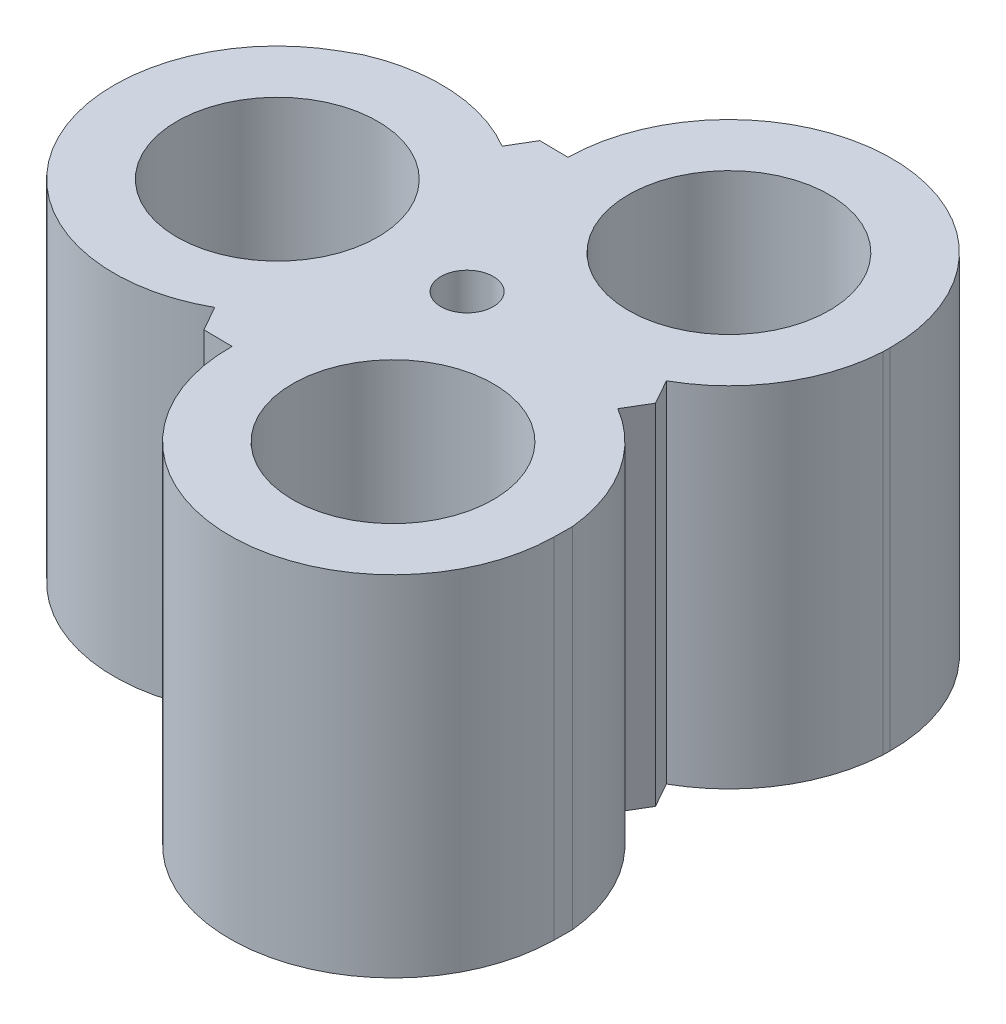
ISO-10303-21;
HEADER;
FILE_DESCRIPTION(('STEP AP214'),'2;1');
FILE_NAME('part.step','',(''),(''),'','','');
FILE_SCHEMA(('AUTOMOTIVE_DESIGN { 1 0 10303 214 1 1 1 1 }'));
ENDSEC;
DATA;
#1=APPLICATION_CONTEXT('core data for automotive mechanical design processes');
#2=APPLICATION_PROTOCOL_DEFINITION('international standard','automotive_design',2000,#1);
#3=PRODUCT_CONTEXT('',#1,'mechanical');
#4=PRODUCT('Part','Part','',(#3));
#5=PRODUCT_RELATED_PRODUCT_CATEGORY('part','',(#4));
#6=PRODUCT_DEFINITION_FORMATION('','',#4);
#7=PRODUCT_DEFINITION_CONTEXT('part definition',#1,'design');
#8=PRODUCT_DEFINITION('design','',#6,#7);
#9=PRODUCT_DEFINITION_SHAPE('','',#8);
#10=(LENGTH_UNIT() NAMED_UNIT(*) SI_UNIT(.MILLI.,.METRE.));
#11=(NAMED_UNIT(*) PLANE_ANGLE_UNIT() SI_UNIT($,.RADIAN.));
#12=(NAMED_UNIT(*) SI_UNIT($,.STERADIAN.) SOLID_ANGLE_UNIT());
#13=UNCERTAINTY_MEASURE_WITH_UNIT(LENGTH_MEASURE(1.E-05),#10,'distance_accuracy_value','');
#14=(GEOMETRIC_REPRESENTATION_CONTEXT(3) GLOBAL_UNCERTAINTY_ASSIGNED_CONTEXT((#13)) GLOBAL_UNIT_ASSIGNED_CONTEXT((#10,
#11,#12)) REPRESENTATION_CONTEXT('',''));
#15=CARTESIAN_POINT('',(0.,0.,0.));
#16=DIRECTION('',(0.,0.,1.));
#17=DIRECTION('',(1.,0.,0.));
#18=AXIS2_PLACEMENT_3D('',#15,#16,#17);
#19=CARTESIAN_POINT('',(0.,20.,0.));
#20=DIRECTION('',(0.,1.,0.));
#21=DIRECTION('',(0.,0.,1.));
#22=AXIS2_PLACEMENT_3D('',#19,#20,#21);
#23=PLANE('',#22);
#24=CARTESIAN_POINT('',(0.,20.,0.));
#25=DIRECTION('',(0.,1.,0.));
#26=DIRECTION('',(0.,0.,1.));
#27=AXIS2_PLACEMENT_3D('',#24,#25,#26);
#28=CIRCLE('',#27,1.5);
#29=CARTESIAN_POINT('',(0.,20.,1.5));
#30=VERTEX_POINT('',#29);
#31=EDGE_CURVE('E441',#30,#30,#28,.T.);
#32=ORIENTED_EDGE('',*,*,#31,.F.);
#33=EDGE_LOOP('',(#32));
#34=FACE_BOUND('',#33,.T.);
#35=CARTESIAN_POINT('',(5.56465245460964,20.,-9.43064913245143));
#36=DIRECTION('',(0.,1.,0.));
#37=DIRECTION('',(0.,0.,1.));
#38=AXIS2_PLACEMENT_3D('',#35,#36,#37);
#39=CIRCLE('',#38,5.75000000000001);
#40=CARTESIAN_POINT('',(5.56465245460964,20.,-3.68064913245143));
#41=VERTEX_POINT('',#40);
#42=EDGE_CURVE('E373',#41,#41,#39,.T.);
#43=ORIENTED_EDGE('',*,*,#42,.F.);
#44=EDGE_LOOP('',(#43));
#45=FACE_BOUND('',#44,.T.);
#46=CARTESIAN_POINT('',(5.32530520249275,20.,9.56784325228541));
#47=DIRECTION('',(0.,1.,0.));
#48=DIRECTION('',(0.,0.,1.));
#49=AXIS2_PLACEMENT_3D('',#46,#47,#48);
#50=CIRCLE('',#49,5.75);
#51=CARTESIAN_POINT('',(5.32530520249275,20.,15.3178432522854));
#52=VERTEX_POINT('',#51);
#53=EDGE_CURVE('E368',#52,#52,#50,.T.);
#54=ORIENTED_EDGE('',*,*,#53,.F.);
#55=EDGE_LOOP('',(#54));
#56=FACE_BOUND('',#55,.T.);
#57=CARTESIAN_POINT('',(-11.0081982102361,20.,-0.13868374074223));
#58=DIRECTION('',(0.,1.,0.));
#59=DIRECTION('',(0.,0.,1.));
#60=AXIS2_PLACEMENT_3D('',#57,#58,#59);
#61=CIRCLE('',#60,5.75);
#62=CARTESIAN_POINT('',(-11.0081982102361,20.,5.61131625925777));
#63=VERTEX_POINT('',#62);
#64=EDGE_CURVE('E372',#63,#63,#61,.T.);
#65=ORIENTED_EDGE('',*,*,#64,.F.);
#66=EDGE_LOOP('',(#65));
#67=FACE_BOUND('',#66,.T.);
#68=DIRECTION('',(-0.510869841738297,0.,0.859658074354151));
#69=VECTOR('',#68,1.);
#70=CARTESIAN_POINT('',(-1.1006195570536,20.,-16.8105036264622));
#71=LINE('',#70,#69);
#72=CARTESIAN_POINT('',(-5.40413223791524,20.,-9.56883633289091));
#73=VERTEX_POINT('',#72);
#74=CARTESIAN_POINT('',(-6.20931797443657,20.,-8.21392288292074));
#75=VERTEX_POINT('',#74);
#76=EDGE_CURVE('E448',#73,#75,#71,.T.);
#77=ORIENTED_EDGE('',*,*,#76,.T.);
#78=CARTESIAN_POINT('',(-11.0081982102361,20.,-0.13868374074223));
#79=DIRECTION('',(0.,1.,0.));
#80=DIRECTION('',(0.,0.,1.));
#81=AXIS2_PLACEMENT_3D('',#78,#79,#80);
#82=CIRCLE('',#81,9.3935477174984);
#83=CARTESIAN_POINT('',(-14.7353188442584,20.,-8.76117238963965));
#84=VERTEX_POINT('',#83);
#85=EDGE_CURVE('E343',#75,#84,#82,.T.);
#86=ORIENTED_EDGE('',*,*,#85,.T.);
#87=DIRECTION('',(-0.872255298149777,0.,0.489050810089958));
#88=VECTOR('',#87,1.);
#89=CARTESIAN_POINT('',(-15.5777729634688,20.,-8.28883032380479));
#90=LINE('',#89,#88);
#91=CARTESIAN_POINT('',(-15.5777729634688,20.,-8.28883032380479));
#92=VERTEX_POINT('',#91);
#93=EDGE_CURVE('E339',#84,#92,#90,.T.);
#94=ORIENTED_EDGE('',*,*,#93,.T.);
#95=CARTESIAN_POINT('',(-11.0081982102361,20.,-0.13868374074223));
#96=DIRECTION('',(0.,1.,0.));
#97=DIRECTION('',(0.,0.,1.));
#98=AXIS2_PLACEMENT_3D('',#95,#96,#97);
#99=CIRCLE('',#98,9.34376277260867);
#100=CARTESIAN_POINT('',(-6.43862345700346,20.,8.01146284232033));
#101=VERTEX_POINT('',#100);
#102=EDGE_CURVE('E342',#92,#101,#99,.T.);
#103=ORIENTED_EDGE('',*,*,#102,.T.);
#104=DIRECTION('',(0.489050810089958,0.,0.872255298149777));
#105=VECTOR('',#104,1.);
#106=CARTESIAN_POINT('',(-6.43862345700346,20.,8.01146284232033));
#107=LINE('',#106,#105);
#108=CARTESIAN_POINT('',(-5.64347949003213,20.,9.42965605184594));
#109=VERTEX_POINT('',#108);
#110=EDGE_CURVE('E187',#101,#109,#107,.T.);
#111=ORIENTED_EDGE('',*,*,#110,.T.);
#112=DIRECTION('',(0.999920651828255,0.,0.0125972237956252));
#113=VECTOR('',#112,1.);
#114=CARTESIAN_POINT('',(-14.0084680002886,20.,9.32427205750712));
#115=LINE('',#114,#113);
#116=CARTESIAN_POINT('',(-4.00926148200608,20.,9.45024429546337));
#117=VERTEX_POINT('',#116);
#118=EDGE_CURVE('E318',#109,#117,#115,.T.);
#119=ORIENTED_EDGE('',*,*,#118,.T.);
#120=CARTESIAN_POINT('',(5.32530520249275,20.,9.56784325228541));
#121=DIRECTION('',(0.,1.,0.));
#122=DIRECTION('',(0.,0.,1.));
#123=AXIS2_PLACEMENT_3D('',#120,#121,#122);
#124=CIRCLE('',#123,9.33530742407561);
#125=CARTESIAN_POINT('',(14.6598718869916,20.,9.68544220910746));
#126=VERTEX_POINT('',#125);
#127=EDGE_CURVE('E313',#117,#126,#124,.T.);
#128=ORIENTED_EDGE('',*,*,#127,.T.);
#129=DIRECTION('',(0.0125972237956255,0.,-0.999920651828255));
#130=VECTOR('',#129,1.);
#131=CARTESIAN_POINT('',(14.8992191391085,20.,-9.31305017562939));
#132=LINE('',#131,#130);
#133=CARTESIAN_POINT('',(14.6730284435592,20.,8.64112380749925));
#134=VERTEX_POINT('',#133);
#135=EDGE_CURVE('E291',#126,#134,#132,.T.);
#136=ORIENTED_EDGE('',*,*,#135,.T.);
#137=CARTESIAN_POINT('',(5.32530520249275,20.,9.56784325228541));
#138=DIRECTION('',(0.,1.,0.));
#139=DIRECTION('',(0.,0.,1.));
#140=AXIS2_PLACEMENT_3D('',#137,#138,#139);
#141=CIRCLE('',#140,9.3935477174984);
#142=CARTESIAN_POINT('',(10.1241854382923,20.,1.4926041101069));
#143=VERTEX_POINT('',#142);
#144=EDGE_CURVE('E301',#134,#143,#141,.T.);
#145=ORIENTED_EDGE('',*,*,#144,.T.);
#146=DIRECTION('',(0.510869841738297,0.,-0.859658074354152));
#147=VECTOR('',#146,1.);
#148=CARTESIAN_POINT('',(10.1241854382923,20.,1.4926041101069));
#149=LINE('',#148,#147);
#150=CARTESIAN_POINT('',(10.9293711748136,20.,0.137690660136722));
#151=VERTEX_POINT('',#150);
#152=EDGE_CURVE('E309',#143,#151,#149,.T.);
#153=ORIENTED_EDGE('',*,*,#152,.T.);
#154=DIRECTION('',(-0.489050810089957,0.,-0.872255298149777));
#155=VECTOR('',#154,1.);
#156=CARTESIAN_POINT('',(15.0247353087419,20.,7.4420504321089));
#157=LINE('',#156,#155);
#158=CARTESIAN_POINT('',(10.1342272078423,20.,-1.28050254938887));
#159=VERTEX_POINT('',#158);
#160=EDGE_CURVE('E331',#151,#159,#157,.T.);
#161=ORIENTED_EDGE('',*,*,#160,.T.);
#162=CARTESIAN_POINT('',(5.56465245460964,20.,-9.43064913245143));
#163=DIRECTION('',(0.,1.,0.));
#164=DIRECTION('',(0.,0.,1.));
#165=AXIS2_PLACEMENT_3D('',#162,#163,#164);
#166=CIRCLE('',#165,9.34376277260867);
#167=CARTESIAN_POINT('',(14.8942128234531,20.,-8.91566750666909));
#168=VERTEX_POINT('',#167);
#169=EDGE_CURVE('E324',#159,#168,#166,.T.);
#170=ORIENTED_EDGE('',*,*,#169,.T.);
#171=CARTESIAN_POINT('',(14.8992191391085,20.,-9.31305017562939));
#172=VERTEX_POINT('',#171);
#173=EDGE_CURVE('E316',#168,#172,#132,.T.);
#174=ORIENTED_EDGE('',*,*,#173,.T.);
#175=CARTESIAN_POINT('',(5.56465245460964,20.,-9.43064913245143));
#176=DIRECTION('',(0.,1.,0.));
#177=DIRECTION('',(0.,0.,1.));
#178=AXIS2_PLACEMENT_3D('',#175,#176,#177);
#179=CIRCLE('',#178,9.33530742407561);
#180=CARTESIAN_POINT('',(-3.7699142298892,20.,-9.54824808927347));
#181=VERTEX_POINT('',#180);
#182=EDGE_CURVE('E323',#172,#181,#179,.T.);
#183=ORIENTED_EDGE('',*,*,#182,.T.);
#184=DIRECTION('',(-0.999920651828255,0.,-0.0125972237956252));
#185=VECTOR('',#184,1.);
#186=CARTESIAN_POINT('',(-3.7699142298892,20.,-9.54824808927347));
#187=LINE('',#186,#185);
#188=EDGE_CURVE('E330',#181,#73,#187,.T.);
#189=ORIENTED_EDGE('',*,*,#188,.T.);
#190=EDGE_LOOP('',(#77,#86,#94,#103,#111,#119,#128,#136,#145,#153,#161,#170,#174,#183,#189));
#191=FACE_BOUND('',#190,.T.);
#192=ADVANCED_FACE('F183',(#34,#45,#56,#67,#191),#23,.T.);
#193=CARTESIAN_POINT('',(0.,0.,0.));
#194=DIRECTION('',(0.,1.,0.));
#195=DIRECTION('',(0.,0.,1.));
#196=AXIS2_PLACEMENT_3D('',#193,#194,#195);
#197=PLANE('',#196);
#198=CARTESIAN_POINT('',(0.,0.,0.));
#199=DIRECTION('',(0.,1.,0.));
#200=DIRECTION('',(0.,0.,1.));
#201=AXIS2_PLACEMENT_3D('',#198,#199,#200);
#202=CIRCLE('',#201,1.5);
#203=CARTESIAN_POINT('',(0.,0.,1.5));
#204=VERTEX_POINT('',#203);
#205=EDGE_CURVE('E445',#204,#204,#202,.T.);
#206=ORIENTED_EDGE('',*,*,#205,.T.);
#207=EDGE_LOOP('',(#206));
#208=FACE_BOUND('',#207,.T.);
#209=CARTESIAN_POINT('',(5.56465245460964,0.,-9.43064913245143));
#210=DIRECTION('',(0.,1.,0.));
#211=DIRECTION('',(0.,0.,1.));
#212=AXIS2_PLACEMENT_3D('',#209,#210,#211);
#213=CIRCLE('',#212,5.75000000000001);
#214=CARTESIAN_POINT('',(5.56465245460964,0.,-3.68064913245143));
#215=VERTEX_POINT('',#214);
#216=EDGE_CURVE('E382',#215,#215,#213,.T.);
#217=ORIENTED_EDGE('',*,*,#216,.T.);
#218=EDGE_LOOP('',(#217));
#219=FACE_BOUND('',#218,.T.);
#220=CARTESIAN_POINT('',(5.32530520249275,0.,9.56784325228541));
#221=DIRECTION('',(0.,1.,0.));
#222=DIRECTION('',(0.,0.,1.));
#223=AXIS2_PLACEMENT_3D('',#220,#221,#222);
#224=CIRCLE('',#223,5.75);
#225=CARTESIAN_POINT('',(5.32530520249275,0.,15.3178432522854));
#226=VERTEX_POINT('',#225);
#227=EDGE_CURVE('E386',#226,#226,#224,.T.);
#228=ORIENTED_EDGE('',*,*,#227,.T.);
#229=EDGE_LOOP('',(#228));
#230=FACE_BOUND('',#229,.T.);
#231=CARTESIAN_POINT('',(-11.0081982102361,0.,-0.13868374074223));
#232=DIRECTION('',(0.,1.,0.));
#233=DIRECTION('',(0.,0.,1.));
#234=AXIS2_PLACEMENT_3D('',#231,#232,#233);
#235=CIRCLE('',#234,5.75);
#236=CARTESIAN_POINT('',(-11.0081982102361,0.,5.61131625925777));
#237=VERTEX_POINT('',#236);
#238=EDGE_CURVE('E381',#237,#237,#235,.T.);
#239=ORIENTED_EDGE('',*,*,#238,.T.);
#240=EDGE_LOOP('',(#239));
#241=FACE_BOUND('',#240,.T.);
#242=CARTESIAN_POINT('',(-11.0081982102361,0.,-0.13868374074223));
#243=DIRECTION('',(0.,1.,0.));
#244=DIRECTION('',(0.,0.,1.));
#245=AXIS2_PLACEMENT_3D('',#242,#243,#244);
#246=CIRCLE('',#245,9.3935477174984);
#247=CARTESIAN_POINT('',(-6.20931797443657,0.,-8.21392288292074));
#248=VERTEX_POINT('',#247);
#249=CARTESIAN_POINT('',(-14.7353188442583,0.,-8.76117238963968));
#250=VERTEX_POINT('',#249);
#251=EDGE_CURVE('E437',#248,#250,#246,.T.);
#252=ORIENTED_EDGE('',*,*,#251,.F.);
#253=DIRECTION('',(-0.510869841738297,0.,0.859658074354151));
#254=VECTOR('',#253,1.);
#255=CARTESIAN_POINT('',(-8.19609683638978,0.,-4.87070245553611));
#256=LINE('',#255,#254);
#257=CARTESIAN_POINT('',(-5.40413223791524,0.,-9.56883633289091));
#258=VERTEX_POINT('',#257);
#259=EDGE_CURVE('E428',#258,#248,#256,.T.);
#260=ORIENTED_EDGE('',*,*,#259,.F.);
#261=DIRECTION('',(-0.999920651828255,0.,-0.0125972237956252));
#262=VECTOR('',#261,1.);
#263=CARTESIAN_POINT('',(0.11967362605844,0.,-9.49924619236842));
#264=LINE('',#263,#262);
#265=CARTESIAN_POINT('',(-3.7699142298892,0.,-9.54824808927347));
#266=VERTEX_POINT('',#265);
#267=EDGE_CURVE('E366',#266,#258,#264,.T.);
#268=ORIENTED_EDGE('',*,*,#267,.F.);
#269=CARTESIAN_POINT('',(5.56465245460964,0.,-9.43064913245143));
#270=DIRECTION('',(0.,1.,0.));
#271=DIRECTION('',(0.,0.,1.));
#272=AXIS2_PLACEMENT_3D('',#269,#270,#271);
#273=CIRCLE('',#272,9.33530742407561);
#274=CARTESIAN_POINT('',(14.8992191391085,0.,-9.31305017562939));
#275=VERTEX_POINT('',#274);
#276=EDGE_CURVE('E367',#275,#266,#273,.T.);
#277=ORIENTED_EDGE('',*,*,#276,.F.);
#278=DIRECTION('',(0.0125972237956255,0.,-0.999920651828255));
#279=VECTOR('',#278,1.);
#280=CARTESIAN_POINT('',(14.77954551305,0.,0.186196016739038));
#281=LINE('',#280,#279);
#282=CARTESIAN_POINT('',(14.8942128234531,0.,-8.91566750666905));
#283=VERTEX_POINT('',#282);
#284=EDGE_CURVE('E362',#283,#275,#281,.T.);
#285=ORIENTED_EDGE('',*,*,#284,.F.);
#286=CARTESIAN_POINT('',(5.56465245460964,0.,-9.43064913245143));
#287=DIRECTION('',(0.,1.,0.));
#288=DIRECTION('',(0.,0.,1.));
#289=AXIS2_PLACEMENT_3D('',#286,#287,#288);
#290=CIRCLE('',#289,9.34376277260867);
#291=CARTESIAN_POINT('',(10.1342272078423,0.,-1.28050254938887));
#292=VERTEX_POINT('',#291);
#293=EDGE_CURVE('E403',#292,#283,#290,.T.);
#294=ORIENTED_EDGE('',*,*,#293,.F.);
#295=DIRECTION('',(-0.489050810089957,0.,-0.872255298149777));
#296=VECTOR('',#295,1.);
#297=CARTESIAN_POINT('',(8.25665018588136,0.,-4.62928854728643));
#298=LINE('',#297,#296);
#299=CARTESIAN_POINT('',(10.9293711748136,0.,0.137690660136721));
#300=VERTEX_POINT('',#299);
#301=EDGE_CURVE('E393',#300,#292,#298,.T.);
#302=ORIENTED_EDGE('',*,*,#301,.F.);
#303=DIRECTION('',(0.510869841738296,0.,-0.859658074354152));
#304=VECTOR('',#303,1.);
#305=CARTESIAN_POINT('',(8.13740657633909,0.,4.83582453749153));
#306=LINE('',#305,#304);
#307=CARTESIAN_POINT('',(10.1241854382923,0.,1.4926041101069));
#308=VERTEX_POINT('',#307);
#309=EDGE_CURVE('E398',#308,#300,#306,.T.);
#310=ORIENTED_EDGE('',*,*,#309,.F.);
#311=CARTESIAN_POINT('',(5.32530520249275,0.,9.56784325228541));
#312=DIRECTION('',(0.,1.,0.));
#313=DIRECTION('',(0.,0.,1.));
#314=AXIS2_PLACEMENT_3D('',#311,#312,#313);
#315=CIRCLE('',#314,9.3935477174984);
#316=CARTESIAN_POINT('',(14.6730284435592,0.,8.64112380749923));
#317=VERTEX_POINT('',#316);
#318=EDGE_CURVE('E406',#317,#308,#315,.T.);
#319=ORIENTED_EDGE('',*,*,#318,.F.);
#320=DIRECTION('',(0.0125972237956255,0.,-0.999920651828255));
#321=VECTOR('',#320,1.);
#322=CARTESIAN_POINT('',(14.77954551305,0.,0.186196016739038));
#323=LINE('',#322,#321);
#324=CARTESIAN_POINT('',(14.6598718869916,0.,9.68544220910746));
#325=VERTEX_POINT('',#324);
#326=EDGE_CURVE('E294',#325,#317,#323,.T.);
#327=ORIENTED_EDGE('',*,*,#326,.F.);
#328=CARTESIAN_POINT('',(5.32530520249275,0.,9.56784325228541));
#329=DIRECTION('',(0.,1.,0.));
#330=DIRECTION('',(0.,0.,1.));
#331=AXIS2_PLACEMENT_3D('',#328,#329,#330);
#332=CIRCLE('',#331,9.33530742407561);
#333=CARTESIAN_POINT('',(-4.00926148200608,0.,9.45024429546337));
#334=VERTEX_POINT('',#333);
#335=EDGE_CURVE('E357',#334,#325,#332,.T.);
#336=ORIENTED_EDGE('',*,*,#335,.F.);
#337=DIRECTION('',(0.999920651828255,0.,0.0125972237956252));
#338=VECTOR('',#337,1.);
#339=CARTESIAN_POINT('',(-0.119673626058439,0.,9.49924619236842));
#340=LINE('',#339,#338);
#341=CARTESIAN_POINT('',(-5.64347949003213,0.,9.42965605184594));
#342=VERTEX_POINT('',#341);
#343=EDGE_CURVE('E298',#342,#334,#340,.T.);
#344=ORIENTED_EDGE('',*,*,#343,.F.);
#345=DIRECTION('',(0.489050810089958,0.,0.872255298149777));
#346=VECTOR('',#345,1.);
#347=CARTESIAN_POINT('',(-8.31620047896441,0.,4.66267684442276));
#348=LINE('',#347,#346);
#349=CARTESIAN_POINT('',(-6.43862345700346,0.,8.01146284232033));
#350=VERTEX_POINT('',#349);
#351=EDGE_CURVE('E377',#350,#342,#348,.T.);
#352=ORIENTED_EDGE('',*,*,#351,.F.);
#353=CARTESIAN_POINT('',(-11.0081982102361,0.,-0.13868374074223));
#354=DIRECTION('',(0.,1.,0.));
#355=DIRECTION('',(0.,0.,1.));
#356=AXIS2_PLACEMENT_3D('',#353,#354,#355);
#357=CIRCLE('',#356,9.34376277260867);
#358=CARTESIAN_POINT('',(-15.5777729634688,0.,-8.28883032380479));
#359=VERTEX_POINT('',#358);
#360=EDGE_CURVE('E427',#359,#350,#357,.T.);
#361=ORIENTED_EDGE('',*,*,#360,.F.);
#362=DIRECTION('',(-0.872255298149777,0.,0.489050810089958));
#363=VECTOR('',#362,1.);
#364=CARTESIAN_POINT('',(-7.26157248450438,0.,-12.9515071682276));
#365=LINE('',#364,#363);
#366=EDGE_CURVE('E254',#250,#359,#365,.T.);
#367=ORIENTED_EDGE('',*,*,#366,.F.);
#368=EDGE_LOOP('',(#252,#260,#268,#277,#285,#294,#302,#310,#319,#327,#336,#344,#352,#361,#367));
#369=FACE_BOUND('',#368,.T.);
#370=ADVANCED_FACE('F185',(#208,#219,#230,#241,#369),#197,.F.);
#371=CARTESIAN_POINT('',(5.56465245460964,-30.,-9.43064913245143));
#372=DIRECTION('',(0.,1.,0.));
#373=DIRECTION('',(0.,0.,1.));
#374=AXIS2_PLACEMENT_3D('',#371,#372,#373);
#375=CYLINDRICAL_SURFACE('',#374,5.75000000000001);
#376=ORIENTED_EDGE('',*,*,#42,.T.);
#377=EDGE_LOOP('',(#376));
#378=FACE_BOUND('',#377,.T.);
#379=ORIENTED_EDGE('',*,*,#216,.F.);
#380=EDGE_LOOP('',(#379));
#381=FACE_BOUND('',#380,.T.);
#382=ADVANCED_FACE('F536',(#378,#381),#375,.F.);
#383=CARTESIAN_POINT('',(5.32530520249275,-30.,9.56784325228541));
#384=DIRECTION('',(0.,1.,0.));
#385=DIRECTION('',(0.,0.,1.));
#386=AXIS2_PLACEMENT_3D('',#383,#384,#385);
#387=CYLINDRICAL_SURFACE('',#386,5.75);
#388=ORIENTED_EDGE('',*,*,#53,.T.);
#389=EDGE_LOOP('',(#388));
#390=FACE_BOUND('',#389,.T.);
#391=ORIENTED_EDGE('',*,*,#227,.F.);
#392=EDGE_LOOP('',(#391));
#393=FACE_BOUND('',#392,.T.);
#394=ADVANCED_FACE('F549',(#390,#393),#387,.F.);
#395=CARTESIAN_POINT('',(-11.0081982102361,-30.,-0.13868374074223));
#396=DIRECTION('',(0.,1.,0.));
#397=DIRECTION('',(0.,0.,1.));
#398=AXIS2_PLACEMENT_3D('',#395,#396,#397);
#399=CYLINDRICAL_SURFACE('',#398,5.75);
#400=ORIENTED_EDGE('',*,*,#64,.T.);
#401=EDGE_LOOP('',(#400));
#402=FACE_BOUND('',#401,.T.);
#403=ORIENTED_EDGE('',*,*,#238,.F.);
#404=EDGE_LOOP('',(#403));
#405=FACE_BOUND('',#404,.T.);
#406=ADVANCED_FACE('F571',(#402,#405),#399,.F.);
#407=CARTESIAN_POINT('',(-6.43862345700346,-30.,8.01146284232033));
#408=DIRECTION('',(-0.872255298149777,0.,0.489050810089957));
#409=DIRECTION('',(0.489050810089958,0.,0.872255298149777));
#410=AXIS2_PLACEMENT_3D('',#407,#408,#409);
#411=PLANE('',#410);
#412=ORIENTED_EDGE('',*,*,#351,.T.);
#413=DIRECTION('',(0.,-1.,0.));
#414=VECTOR('',#413,1.);
#415=CARTESIAN_POINT('',(-5.64347949003213,-30.,9.42965605184594));
#416=LINE('',#415,#414);
#417=EDGE_CURVE('E12',#109,#342,#416,.T.);
#418=ORIENTED_EDGE('',*,*,#417,.F.);
#419=ORIENTED_EDGE('',*,*,#110,.F.);
#420=DIRECTION('',(0.,1.,0.));
#421=VECTOR('',#420,1.);
#422=CARTESIAN_POINT('',(-6.43862345700346,-30.,8.01146284232033));
#423=LINE('',#422,#421);
#424=EDGE_CURVE('E434',#350,#101,#423,.T.);
#425=ORIENTED_EDGE('',*,*,#424,.F.);
#426=EDGE_LOOP('',(#412,#418,#419,#425));
#427=FACE_BOUND('',#426,.T.);
#428=ADVANCED_FACE('F567',(#427),#411,.T.);
#429=CARTESIAN_POINT('',(-11.0081982102361,-30.,-0.13868374074223));
#430=DIRECTION('',(0.,1.,0.));
#431=DIRECTION('',(0.,0.,1.));
#432=AXIS2_PLACEMENT_3D('',#429,#430,#431);
#433=CYLINDRICAL_SURFACE('',#432,9.34376277260867);
#434=ORIENTED_EDGE('',*,*,#360,.T.);
#435=ORIENTED_EDGE('',*,*,#424,.T.);
#436=ORIENTED_EDGE('',*,*,#102,.F.);
#437=DIRECTION('',(0.,1.,0.));
#438=VECTOR('',#437,1.);
#439=CARTESIAN_POINT('',(-15.5777729634688,-30.,-8.28883032380479));
#440=LINE('',#439,#438);
#441=EDGE_CURVE('E247',#359,#92,#440,.T.);
#442=ORIENTED_EDGE('',*,*,#441,.F.);
#443=EDGE_LOOP('',(#434,#435,#436,#442));
#444=FACE_BOUND('',#443,.T.);
#445=ADVANCED_FACE('F570',(#444),#433,.T.);
#446=CARTESIAN_POINT('',(-15.5777729634688,-30.,-8.28883032380479));
#447=DIRECTION('',(-0.489050810089958,0.,-0.872255298149777));
#448=DIRECTION('',(-0.872255298149777,0.,0.489050810089958));
#449=AXIS2_PLACEMENT_3D('',#446,#447,#448);
#450=PLANE('',#449);
#451=ORIENTED_EDGE('',*,*,#366,.T.);
#452=ORIENTED_EDGE('',*,*,#441,.T.);
#453=ORIENTED_EDGE('',*,*,#93,.F.);
#454=DIRECTION('',(0.,1.,0.));
#455=VECTOR('',#454,1.);
#456=CARTESIAN_POINT('',(-14.7353188442583,-30.,-8.76117238963968));
#457=LINE('',#456,#455);
#458=EDGE_CURVE('E417',#250,#84,#457,.T.);
#459=ORIENTED_EDGE('',*,*,#458,.F.);
#460=EDGE_LOOP('',(#451,#452,#453,#459));
#461=FACE_BOUND('',#460,.T.);
#462=ADVANCED_FACE('F566',(#461),#450,.T.);
#463=CARTESIAN_POINT('',(-1.1006195570536,-30.,-16.8105036264622));
#464=DIRECTION('',(-0.859658074354151,0.,-0.510869841738297));
#465=DIRECTION('',(-0.510869841738297,0.,0.859658074354151));
#466=AXIS2_PLACEMENT_3D('',#463,#464,#465);
#467=PLANE('',#466);
#468=ORIENTED_EDGE('',*,*,#259,.T.);
#469=DIRECTION('',(0.,1.,0.));
#470=VECTOR('',#469,1.);
#471=CARTESIAN_POINT('',(-6.20931797443657,-30.,-8.21392288292074));
#472=LINE('',#471,#470);
#473=EDGE_CURVE('E431',#248,#75,#472,.T.);
#474=ORIENTED_EDGE('',*,*,#473,.T.);
#475=ORIENTED_EDGE('',*,*,#76,.F.);
#476=DIRECTION('',(0.,1.,0.));
#477=VECTOR('',#476,1.);
#478=CARTESIAN_POINT('',(-5.40413223791524,-30.,-9.56883633289091));
#479=LINE('',#478,#477);
#480=EDGE_CURVE('E397',#258,#73,#479,.T.);
#481=ORIENTED_EDGE('',*,*,#480,.F.);
#482=EDGE_LOOP('',(#468,#474,#475,#481));
#483=FACE_BOUND('',#482,.T.);
#484=ADVANCED_FACE('F505',(#483),#467,.T.);
#485=CARTESIAN_POINT('',(-11.0081982102361,-30.,-0.13868374074223));
#486=DIRECTION('',(0.,1.,0.));
#487=DIRECTION('',(0.,0.,1.));
#488=AXIS2_PLACEMENT_3D('',#485,#486,#487);
#489=CYLINDRICAL_SURFACE('',#488,9.3935477174984);
#490=ORIENTED_EDGE('',*,*,#251,.T.);
#491=ORIENTED_EDGE('',*,*,#458,.T.);
#492=ORIENTED_EDGE('',*,*,#85,.F.);
#493=ORIENTED_EDGE('',*,*,#473,.F.);
#494=EDGE_LOOP('',(#490,#491,#492,#493));
#495=FACE_BOUND('',#494,.T.);
#496=ADVANCED_FACE('F508',(#495),#489,.T.);
#497=CARTESIAN_POINT('',(5.56465245460964,-30.,-9.43064913245143));
#498=DIRECTION('',(0.,1.,0.));
#499=DIRECTION('',(0.,0.,1.));
#500=AXIS2_PLACEMENT_3D('',#497,#498,#499);
#501=CYLINDRICAL_SURFACE('',#500,9.33530742407561);
#502=ORIENTED_EDGE('',*,*,#276,.T.);
#503=DIRECTION('',(0.,1.,0.));
#504=VECTOR('',#503,1.);
#505=CARTESIAN_POINT('',(-3.7699142298892,-30.,-9.54824808927347));
#506=LINE('',#505,#504);
#507=EDGE_CURVE('E363',#266,#181,#506,.T.);
#508=ORIENTED_EDGE('',*,*,#507,.T.);
#509=ORIENTED_EDGE('',*,*,#182,.F.);
#510=DIRECTION('',(0.,1.,0.));
#511=VECTOR('',#510,1.);
#512=CARTESIAN_POINT('',(14.8992191391085,-30.,-9.31305017562939));
#513=LINE('',#512,#511);
#514=EDGE_CURVE('E358',#275,#172,#513,.T.);
#515=ORIENTED_EDGE('',*,*,#514,.F.);
#516=EDGE_LOOP('',(#502,#508,#509,#515));
#517=FACE_BOUND('',#516,.T.);
#518=ADVANCED_FACE('F491',(#517),#501,.T.);
#519=CARTESIAN_POINT('',(-3.7699142298892,-30.,-9.54824808927347));
#520=DIRECTION('',(0.0125972237956252,0.,-0.999920651828255));
#521=DIRECTION('',(-0.999920651828255,0.,-0.0125972237956252));
#522=AXIS2_PLACEMENT_3D('',#519,#520,#521);
#523=PLANE('',#522);
#524=ORIENTED_EDGE('',*,*,#267,.T.);
#525=ORIENTED_EDGE('',*,*,#480,.T.);
#526=ORIENTED_EDGE('',*,*,#188,.F.);
#527=ORIENTED_EDGE('',*,*,#507,.F.);
#528=EDGE_LOOP('',(#524,#525,#526,#527));
#529=FACE_BOUND('',#528,.T.);
#530=ADVANCED_FACE('F498',(#529),#523,.T.);
#531=CARTESIAN_POINT('',(15.0247353087419,-30.,7.4420504321089));
#532=DIRECTION('',(0.872255298149777,0.,-0.489050810089957));
#533=DIRECTION('',(-0.489050810089957,0.,-0.872255298149777));
#534=AXIS2_PLACEMENT_3D('',#531,#532,#533);
#535=PLANE('',#534);
#536=ORIENTED_EDGE('',*,*,#301,.T.);
#537=DIRECTION('',(0.,1.,0.));
#538=VECTOR('',#537,1.);
#539=CARTESIAN_POINT('',(10.1342272078423,-30.,-1.28050254938887));
#540=LINE('',#539,#538);
#541=EDGE_CURVE('E396',#292,#159,#540,.T.);
#542=ORIENTED_EDGE('',*,*,#541,.T.);
#543=ORIENTED_EDGE('',*,*,#160,.F.);
#544=DIRECTION('',(0.,1.,0.));
#545=VECTOR('',#544,1.);
#546=CARTESIAN_POINT('',(10.9293711748136,-30.,0.137690660136723));
#547=LINE('',#546,#545);
#548=EDGE_CURVE('E402',#300,#151,#547,.T.);
#549=ORIENTED_EDGE('',*,*,#548,.F.);
#550=EDGE_LOOP('',(#536,#542,#543,#549));
#551=FACE_BOUND('',#550,.T.);
#552=ADVANCED_FACE('F475',(#551),#535,.T.);
#553=CARTESIAN_POINT('',(10.1241854382923,-30.,1.4926041101069));
#554=DIRECTION('',(0.859658074354152,0.,0.510869841738296));
#555=DIRECTION('',(0.510869841738296,0.,-0.859658074354152));
#556=AXIS2_PLACEMENT_3D('',#553,#554,#555);
#557=PLANE('',#556);
#558=ORIENTED_EDGE('',*,*,#309,.T.);
#559=ORIENTED_EDGE('',*,*,#548,.T.);
#560=ORIENTED_EDGE('',*,*,#152,.F.);
#561=DIRECTION('',(0.,1.,0.));
#562=VECTOR('',#561,1.);
#563=CARTESIAN_POINT('',(10.1241854382923,-30.,1.4926041101069));
#564=LINE('',#563,#562);
#565=EDGE_CURVE('E304',#308,#143,#564,.T.);
#566=ORIENTED_EDGE('',*,*,#565,.F.);
#567=EDGE_LOOP('',(#558,#559,#560,#566));
#568=FACE_BOUND('',#567,.T.);
#569=ADVANCED_FACE('F482',(#568),#557,.T.);
#570=CARTESIAN_POINT('',(5.56465245460964,-30.,-9.43064913245143));
#571=DIRECTION('',(0.,1.,0.));
#572=DIRECTION('',(0.,0.,1.));
#573=AXIS2_PLACEMENT_3D('',#570,#571,#572);
#574=CYLINDRICAL_SURFACE('',#573,9.34376277260867);
#575=ORIENTED_EDGE('',*,*,#293,.T.);
#576=DIRECTION('',(0.,1.,0.));
#577=VECTOR('',#576,1.);
#578=CARTESIAN_POINT('',(14.8942128234531,-30.,-8.91566750666905));
#579=LINE('',#578,#577);
#580=EDGE_CURVE('E361',#168,#283,#579,.F.);
#581=ORIENTED_EDGE('',*,*,#580,.F.);
#582=ORIENTED_EDGE('',*,*,#169,.F.);
#583=ORIENTED_EDGE('',*,*,#541,.F.);
#584=EDGE_LOOP('',(#575,#581,#582,#583));
#585=FACE_BOUND('',#584,.T.);
#586=ADVANCED_FACE('F520',(#585),#574,.T.);
#587=CARTESIAN_POINT('',(5.32530520249275,-30.,9.56784325228541));
#588=DIRECTION('',(0.,1.,0.));
#589=DIRECTION('',(0.,0.,1.));
#590=AXIS2_PLACEMENT_3D('',#587,#588,#589);
#591=CYLINDRICAL_SURFACE('',#590,9.3935477174984);
#592=ORIENTED_EDGE('',*,*,#318,.T.);
#593=ORIENTED_EDGE('',*,*,#565,.T.);
#594=ORIENTED_EDGE('',*,*,#144,.F.);
#595=DIRECTION('',(0.,1.,0.));
#596=VECTOR('',#595,1.);
#597=CARTESIAN_POINT('',(14.6730284435592,-30.,8.64112380749923));
#598=LINE('',#597,#596);
#599=EDGE_CURVE('E286',#317,#134,#598,.T.);
#600=ORIENTED_EDGE('',*,*,#599,.F.);
#601=EDGE_LOOP('',(#592,#593,#594,#600));
#602=FACE_BOUND('',#601,.T.);
#603=ADVANCED_FACE('F302',(#602),#591,.T.);
#604=CARTESIAN_POINT('',(14.8992191391085,-30.,-9.31305017562939));
#605=DIRECTION('',(0.999920651828255,0.,0.0125972237956255));
#606=DIRECTION('',(0.0125972237956255,0.,-0.999920651828255));
#607=AXIS2_PLACEMENT_3D('',#604,#605,#606);
#608=PLANE('',#607);
#609=ORIENTED_EDGE('',*,*,#284,.T.);
#610=ORIENTED_EDGE('',*,*,#514,.T.);
#611=ORIENTED_EDGE('',*,*,#173,.F.);
#612=ORIENTED_EDGE('',*,*,#580,.T.);
#613=EDGE_LOOP('',(#609,#610,#611,#612));
#614=FACE_BOUND('',#613,.T.);
#615=ADVANCED_FACE('F519',(#614),#608,.T.);
#616=CARTESIAN_POINT('',(5.32530520249275,-30.,9.56784325228541));
#617=DIRECTION('',(0.,1.,0.));
#618=DIRECTION('',(0.,0.,1.));
#619=AXIS2_PLACEMENT_3D('',#616,#617,#618);
#620=CYLINDRICAL_SURFACE('',#619,9.33530742407561);
#621=ORIENTED_EDGE('',*,*,#335,.T.);
#622=DIRECTION('',(0.,1.,0.));
#623=VECTOR('',#622,1.);
#624=CARTESIAN_POINT('',(14.6598718869916,-30.,9.68544220910746));
#625=LINE('',#624,#623);
#626=EDGE_CURVE('E354',#325,#126,#625,.T.);
#627=ORIENTED_EDGE('',*,*,#626,.T.);
#628=ORIENTED_EDGE('',*,*,#127,.F.);
#629=DIRECTION('',(0.,1.,0.));
#630=VECTOR('',#629,1.);
#631=CARTESIAN_POINT('',(-4.00926148200608,-30.,9.45024429546337));
#632=LINE('',#631,#630);
#633=EDGE_CURVE('E194',#334,#117,#632,.T.);
#634=ORIENTED_EDGE('',*,*,#633,.F.);
#635=EDGE_LOOP('',(#621,#627,#628,#634));
#636=FACE_BOUND('',#635,.T.);
#637=ADVANCED_FACE('F555',(#636),#620,.T.);
#638=ORIENTED_EDGE('',*,*,#326,.T.);
#639=ORIENTED_EDGE('',*,*,#599,.T.);
#640=ORIENTED_EDGE('',*,*,#135,.F.);
#641=ORIENTED_EDGE('',*,*,#626,.F.);
#642=EDGE_LOOP('',(#638,#639,#640,#641));
#643=FACE_BOUND('',#642,.T.);
#644=ADVANCED_FACE('F288',(#643),#608,.T.);
#645=CARTESIAN_POINT('',(-14.0084680002886,-30.,9.32427205750712));
#646=DIRECTION('',(-0.0125972237956252,0.,0.999920651828255));
#647=DIRECTION('',(0.999920651828255,0.,0.0125972237956252));
#648=AXIS2_PLACEMENT_3D('',#645,#646,#647);
#649=PLANE('',#648);
#650=ORIENTED_EDGE('',*,*,#343,.T.);
#651=ORIENTED_EDGE('',*,*,#633,.T.);
#652=ORIENTED_EDGE('',*,*,#118,.F.);
#653=ORIENTED_EDGE('',*,*,#417,.T.);
#654=EDGE_LOOP('',(#650,#651,#652,#653));
#655=FACE_BOUND('',#654,.T.);
#656=ADVANCED_FACE('F554',(#655),#649,.T.);
#657=CARTESIAN_POINT('',(0.,0.,0.));
#658=DIRECTION('',(0.,1.,0.));
#659=DIRECTION('',(0.,0.,1.));
#660=AXIS2_PLACEMENT_3D('',#657,#658,#659);
#661=CYLINDRICAL_SURFACE('',#660,1.5);
#662=ORIENTED_EDGE('',*,*,#205,.F.);
#663=EDGE_LOOP('',(#662));
#664=FACE_BOUND('',#663,.T.);
#665=ORIENTED_EDGE('',*,*,#31,.T.);
#666=EDGE_LOOP('',(#665));
#667=FACE_BOUND('',#666,.T.);
#668=ADVANCED_FACE('F560',(#664,#667),#661,.F.);
#669=CLOSED_SHELL('',(#192,#370,#382,#394,#406,#428,#445,#462,#484,#496,#518,#530,#552,#569,
#586,#603,#615,#637,#644,#656,#668));
#670=MANIFOLD_SOLID_BREP('B2',#669);
#671=ADVANCED_BREP_SHAPE_REPRESENTATION('',(#18,#670),#14);
#672=SHAPE_DEFINITION_REPRESENTATION(#9,#671);
ENDSEC;
END-ISO-10303-21;
